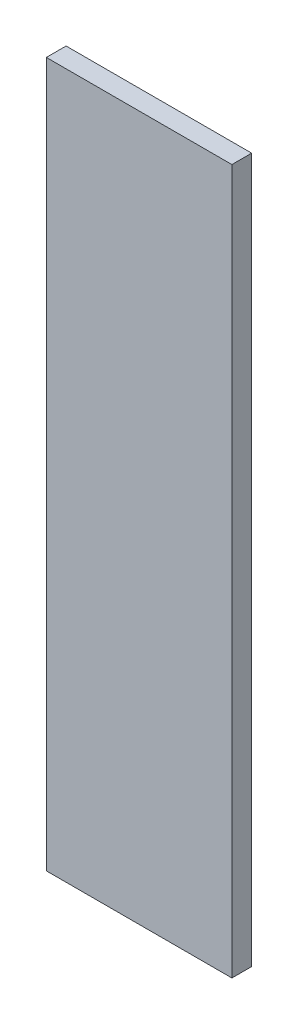
ISO-10303-21;
HEADER;
FILE_DESCRIPTION(('STEP AP214'),'2;1');
FILE_NAME('part.step','',(''),(''),'','','');
FILE_SCHEMA(('AUTOMOTIVE_DESIGN { 1 0 10303 214 1 1 1 1 }'));
ENDSEC;
DATA;
#1=APPLICATION_CONTEXT('core data for automotive mechanical design processes');
#2=APPLICATION_PROTOCOL_DEFINITION('international standard','automotive_design',2000,#1);
#3=PRODUCT_CONTEXT('',#1,'mechanical');
#4=PRODUCT('Part','Part','',(#3));
#5=PRODUCT_RELATED_PRODUCT_CATEGORY('part','',(#4));
#6=PRODUCT_DEFINITION_FORMATION('','',#4);
#7=PRODUCT_DEFINITION_CONTEXT('part definition',#1,'design');
#8=PRODUCT_DEFINITION('design','',#6,#7);
#9=PRODUCT_DEFINITION_SHAPE('','',#8);
#10=(LENGTH_UNIT() NAMED_UNIT(*) SI_UNIT(.MILLI.,.METRE.));
#11=(NAMED_UNIT(*) PLANE_ANGLE_UNIT() SI_UNIT($,.RADIAN.));
#12=(NAMED_UNIT(*) SI_UNIT($,.STERADIAN.) SOLID_ANGLE_UNIT());
#13=UNCERTAINTY_MEASURE_WITH_UNIT(LENGTH_MEASURE(1.E-05),#10,'distance_accuracy_value','');
#14=(GEOMETRIC_REPRESENTATION_CONTEXT(3) GLOBAL_UNCERTAINTY_ASSIGNED_CONTEXT((#13)) GLOBAL_UNIT_ASSIGNED_CONTEXT((#10,
#11,#12)) REPRESENTATION_CONTEXT('',''));
#15=CARTESIAN_POINT('',(0.,0.,0.));
#16=DIRECTION('',(0.,0.,1.));
#17=DIRECTION('',(1.,0.,0.));
#18=AXIS2_PLACEMENT_3D('',#15,#16,#17);
#19=CARTESIAN_POINT('',(-5.4,20.5,1.15));
#20=DIRECTION('',(0.,-1.,0.));
#21=DIRECTION('',(0.,0.,-1.));
#22=AXIS2_PLACEMENT_3D('',#19,#20,#21);
#23=PLANE('',#22);
#24=DIRECTION('',(-1.,0.,0.));
#25=VECTOR('',#24,1.);
#26=CARTESIAN_POINT('',(-5.4,20.5,0.));
#27=LINE('',#26,#25);
#28=CARTESIAN_POINT('',(5.4,20.5,0.));
#29=VERTEX_POINT('',#28);
#30=CARTESIAN_POINT('',(-5.4,20.5,0.));
#31=VERTEX_POINT('',#30);
#32=EDGE_CURVE('E105',#29,#31,#27,.T.);
#33=ORIENTED_EDGE('',*,*,#32,.T.);
#34=DIRECTION('',(0.,0.,-1.));
#35=VECTOR('',#34,1.);
#36=CARTESIAN_POINT('',(-5.4,20.5,1.15));
#37=LINE('',#36,#35);
#38=CARTESIAN_POINT('',(-5.4,20.5,1.15));
#39=VERTEX_POINT('',#38);
#40=EDGE_CURVE('E11',#39,#31,#37,.T.);
#41=ORIENTED_EDGE('',*,*,#40,.F.);
#42=DIRECTION('',(-1.,0.,0.));
#43=VECTOR('',#42,1.);
#44=CARTESIAN_POINT('',(-5.4,20.5,1.15));
#45=LINE('',#44,#43);
#46=CARTESIAN_POINT('',(5.4,20.5,1.15));
#47=VERTEX_POINT('',#46);
#48=EDGE_CURVE('E89',#47,#39,#45,.T.);
#49=ORIENTED_EDGE('',*,*,#48,.F.);
#50=DIRECTION('',(0.,0.,-1.));
#51=VECTOR('',#50,1.);
#52=CARTESIAN_POINT('',(5.4,20.5,1.15));
#53=LINE('',#52,#51);
#54=EDGE_CURVE('E97',#47,#29,#53,.T.);
#55=ORIENTED_EDGE('',*,*,#54,.T.);
#56=EDGE_LOOP('',(#33,#41,#49,#55));
#57=FACE_BOUND('',#56,.T.);
#58=ADVANCED_FACE('F39',(#57),#23,.F.);
#59=CARTESIAN_POINT('',(-5.4,-20.5,1.15));
#60=DIRECTION('',(1.,0.,0.));
#61=DIRECTION('',(0.,0.,-1.));
#62=AXIS2_PLACEMENT_3D('',#59,#60,#61);
#63=PLANE('',#62);
#64=DIRECTION('',(0.,-1.,0.));
#65=VECTOR('',#64,1.);
#66=CARTESIAN_POINT('',(-5.4,-20.5,0.));
#67=LINE('',#66,#65);
#68=CARTESIAN_POINT('',(-5.4,-20.5,0.));
#69=VERTEX_POINT('',#68);
#70=EDGE_CURVE('E92',#31,#69,#67,.T.);
#71=ORIENTED_EDGE('',*,*,#70,.T.);
#72=DIRECTION('',(0.,0.,-1.));
#73=VECTOR('',#72,1.);
#74=CARTESIAN_POINT('',(-5.4,-20.5,1.15));
#75=LINE('',#74,#73);
#76=CARTESIAN_POINT('',(-5.4,-20.5,1.15));
#77=VERTEX_POINT('',#76);
#78=EDGE_CURVE('E50',#77,#69,#75,.T.);
#79=ORIENTED_EDGE('',*,*,#78,.F.);
#80=DIRECTION('',(0.,-1.,0.));
#81=VECTOR('',#80,1.);
#82=CARTESIAN_POINT('',(-5.4,-20.5,1.15));
#83=LINE('',#82,#81);
#84=EDGE_CURVE('E82',#39,#77,#83,.T.);
#85=ORIENTED_EDGE('',*,*,#84,.F.);
#86=ORIENTED_EDGE('',*,*,#40,.T.);
#87=EDGE_LOOP('',(#71,#79,#85,#86));
#88=FACE_BOUND('',#87,.T.);
#89=ADVANCED_FACE('F93',(#88),#63,.F.);
#90=CARTESIAN_POINT('',(-5.4,-20.5,1.15));
#91=DIRECTION('',(0.,1.,0.));
#92=DIRECTION('',(-1.,0.,0.));
#93=AXIS2_PLACEMENT_3D('',#90,#91,#92);
#94=PLANE('',#93);
#95=DIRECTION('',(1.,0.,0.));
#96=VECTOR('',#95,1.);
#97=CARTESIAN_POINT('',(-5.4,-20.5,0.));
#98=LINE('',#97,#96);
#99=CARTESIAN_POINT('',(5.4,-20.5,0.));
#100=VERTEX_POINT('',#99);
#101=EDGE_CURVE('E74',#69,#100,#98,.T.);
#102=ORIENTED_EDGE('',*,*,#101,.T.);
#103=DIRECTION('',(0.,0.,-1.));
#104=VECTOR('',#103,1.);
#105=CARTESIAN_POINT('',(5.4,-20.5,1.15));
#106=LINE('',#105,#104);
#107=CARTESIAN_POINT('',(5.4,-20.5,1.15));
#108=VERTEX_POINT('',#107);
#109=EDGE_CURVE('E94',#108,#100,#106,.T.);
#110=ORIENTED_EDGE('',*,*,#109,.F.);
#111=DIRECTION('',(1.,0.,0.));
#112=VECTOR('',#111,1.);
#113=CARTESIAN_POINT('',(-5.4,-20.5,1.15));
#114=LINE('',#113,#112);
#115=EDGE_CURVE('E88',#77,#108,#114,.T.);
#116=ORIENTED_EDGE('',*,*,#115,.F.);
#117=ORIENTED_EDGE('',*,*,#78,.T.);
#118=EDGE_LOOP('',(#102,#110,#116,#117));
#119=FACE_BOUND('',#118,.T.);
#120=ADVANCED_FACE('F96',(#119),#94,.F.);
#121=CARTESIAN_POINT('',(5.4,-20.5,1.15));
#122=DIRECTION('',(-1.,0.,0.));
#123=DIRECTION('',(0.,0.,1.));
#124=AXIS2_PLACEMENT_3D('',#121,#122,#123);
#125=PLANE('',#124);
#126=DIRECTION('',(0.,1.,0.));
#127=VECTOR('',#126,1.);
#128=CARTESIAN_POINT('',(5.4,-20.5,0.));
#129=LINE('',#128,#127);
#130=EDGE_CURVE('E76',#100,#29,#129,.T.);
#131=ORIENTED_EDGE('',*,*,#130,.T.);
#132=ORIENTED_EDGE('',*,*,#54,.F.);
#133=DIRECTION('',(0.,1.,0.));
#134=VECTOR('',#133,1.);
#135=CARTESIAN_POINT('',(5.4,-20.5,1.15));
#136=LINE('',#135,#134);
#137=EDGE_CURVE('E54',#108,#47,#136,.T.);
#138=ORIENTED_EDGE('',*,*,#137,.F.);
#139=ORIENTED_EDGE('',*,*,#109,.T.);
#140=EDGE_LOOP('',(#131,#132,#138,#139));
#141=FACE_BOUND('',#140,.T.);
#142=ADVANCED_FACE('F106',(#141),#125,.F.);
#143=CARTESIAN_POINT('',(0.,0.,1.15));
#144=DIRECTION('',(0.,0.,1.));
#145=DIRECTION('',(1.,0.,0.));
#146=AXIS2_PLACEMENT_3D('',#143,#144,#145);
#147=PLANE('',#146);
#148=ORIENTED_EDGE('',*,*,#48,.T.);
#149=ORIENTED_EDGE('',*,*,#84,.T.);
#150=ORIENTED_EDGE('',*,*,#115,.T.);
#151=ORIENTED_EDGE('',*,*,#137,.T.);
#152=EDGE_LOOP('',(#148,#149,#150,#151));
#153=FACE_BOUND('',#152,.T.);
#154=ADVANCED_FACE('F86',(#153),#147,.T.);
#155=CARTESIAN_POINT('',(0.,0.,0.));
#156=DIRECTION('',(0.,0.,1.));
#157=DIRECTION('',(1.,0.,0.));
#158=AXIS2_PLACEMENT_3D('',#155,#156,#157);
#159=PLANE('',#158);
#160=ORIENTED_EDGE('',*,*,#32,.F.);
#161=ORIENTED_EDGE('',*,*,#130,.F.);
#162=ORIENTED_EDGE('',*,*,#101,.F.);
#163=ORIENTED_EDGE('',*,*,#70,.F.);
#164=EDGE_LOOP('',(#160,#161,#162,#163));
#165=FACE_BOUND('',#164,.T.);
#166=ADVANCED_FACE('F115',(#165),#159,.F.);
#167=CLOSED_SHELL('',(#58,#89,#120,#142,#154,#166));
#168=MANIFOLD_SOLID_BREP('B2',#167);
#169=ADVANCED_BREP_SHAPE_REPRESENTATION('',(#18,#168),#14);
#170=SHAPE_DEFINITION_REPRESENTATION(#9,#169);
ENDSEC;
END-ISO-10303-21;
